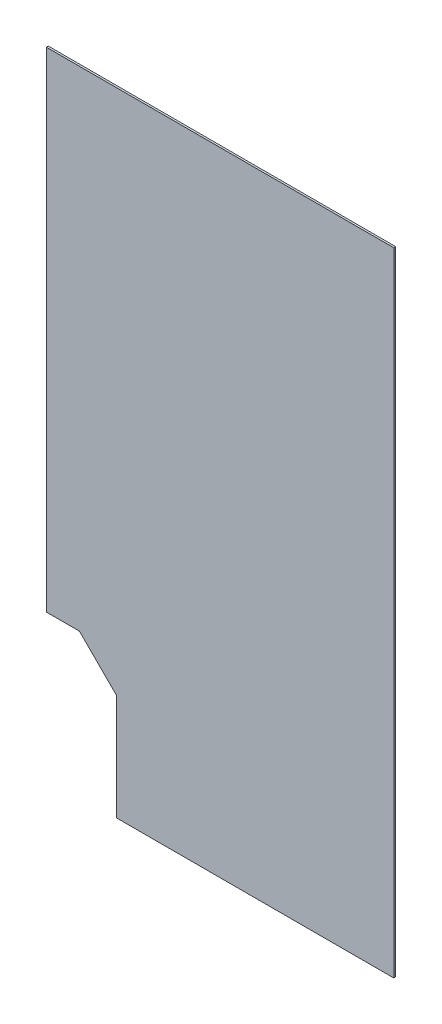
ISO-10303-21;
HEADER;
FILE_DESCRIPTION(('STEP AP214'),'2;1');
FILE_NAME('part.step','',(''),(''),'','','');
FILE_SCHEMA(('AUTOMOTIVE_DESIGN { 1 0 10303 214 1 1 1 1 }'));
ENDSEC;
DATA;
#1=APPLICATION_CONTEXT('core data for automotive mechanical design processes');
#2=APPLICATION_PROTOCOL_DEFINITION('international standard','automotive_design',2000,#1);
#3=PRODUCT_CONTEXT('',#1,'mechanical');
#4=PRODUCT('Part','Part','',(#3));
#5=PRODUCT_RELATED_PRODUCT_CATEGORY('part','',(#4));
#6=PRODUCT_DEFINITION_FORMATION('','',#4);
#7=PRODUCT_DEFINITION_CONTEXT('part definition',#1,'design');
#8=PRODUCT_DEFINITION('design','',#6,#7);
#9=PRODUCT_DEFINITION_SHAPE('','',#8);
#10=(LENGTH_UNIT() NAMED_UNIT(*) SI_UNIT(.MILLI.,.METRE.));
#11=(NAMED_UNIT(*) PLANE_ANGLE_UNIT() SI_UNIT($,.RADIAN.));
#12=(NAMED_UNIT(*) SI_UNIT($,.STERADIAN.) SOLID_ANGLE_UNIT());
#13=UNCERTAINTY_MEASURE_WITH_UNIT(LENGTH_MEASURE(1.E-05),#10,'distance_accuracy_value','');
#14=(GEOMETRIC_REPRESENTATION_CONTEXT(3) GLOBAL_UNCERTAINTY_ASSIGNED_CONTEXT((#13)) GLOBAL_UNIT_ASSIGNED_CONTEXT((#10,
#11,#12)) REPRESENTATION_CONTEXT('',''));
#15=CARTESIAN_POINT('',(0.,0.,0.));
#16=DIRECTION('',(0.,0.,1.));
#17=DIRECTION('',(1.,0.,0.));
#18=AXIS2_PLACEMENT_3D('',#15,#16,#17);
#19=CARTESIAN_POINT('',(941.188811188811,1472.76923076923,8.));
#20=DIRECTION('',(-1.,0.,0.));
#21=DIRECTION('',(0.,-1.,0.));
#22=AXIS2_PLACEMENT_3D('',#19,#20,#21);
#23=PLANE('',#22);
#24=DIRECTION('',(0.,1.,0.));
#25=VECTOR('',#24,1.);
#26=CARTESIAN_POINT('',(941.188811188811,1472.76923076923,0.));
#27=LINE('',#26,#25);
#28=CARTESIAN_POINT('',(941.188811188812,-1102.23076923077,0.));
#29=VERTEX_POINT('',#28);
#30=CARTESIAN_POINT('',(941.188811188811,1472.76923076923,0.));
#31=VERTEX_POINT('',#30);
#32=EDGE_CURVE('E131',#29,#31,#27,.T.);
#33=ORIENTED_EDGE('',*,*,#32,.T.);
#34=DIRECTION('',(0.,0.,-1.));
#35=VECTOR('',#34,1.);
#36=CARTESIAN_POINT('',(941.188811188811,1472.76923076923,8.));
#37=LINE('',#36,#35);
#38=CARTESIAN_POINT('',(941.188811188811,1472.76923076923,8.));
#39=VERTEX_POINT('',#38);
#40=EDGE_CURVE('E11',#39,#31,#37,.T.);
#41=ORIENTED_EDGE('',*,*,#40,.F.);
#42=DIRECTION('',(0.,1.,0.));
#43=VECTOR('',#42,1.);
#44=CARTESIAN_POINT('',(941.188811188811,1472.76923076923,8.));
#45=LINE('',#44,#43);
#46=CARTESIAN_POINT('',(941.188811188812,-1102.23076923077,8.));
#47=VERTEX_POINT('',#46);
#48=EDGE_CURVE('E143',#47,#39,#45,.T.);
#49=ORIENTED_EDGE('',*,*,#48,.F.);
#50=DIRECTION('',(0.,0.,-1.));
#51=VECTOR('',#50,1.);
#52=CARTESIAN_POINT('',(941.188811188812,-1102.23076923077,8.));
#53=LINE('',#52,#51);
#54=EDGE_CURVE('E127',#47,#29,#53,.T.);
#55=ORIENTED_EDGE('',*,*,#54,.T.);
#56=EDGE_LOOP('',(#33,#41,#49,#55));
#57=FACE_BOUND('',#56,.T.);
#58=ADVANCED_FACE('F41',(#57),#23,.F.);
#59=CARTESIAN_POINT('',(-473.811188811189,1472.76923076923,8.));
#60=DIRECTION('',(0.,-1.,0.));
#61=DIRECTION('',(0.,0.,-1.));
#62=AXIS2_PLACEMENT_3D('',#59,#60,#61);
#63=PLANE('',#62);
#64=DIRECTION('',(-1.,0.,0.));
#65=VECTOR('',#64,1.);
#66=CARTESIAN_POINT('',(-473.811188811189,1472.76923076923,0.));
#67=LINE('',#66,#65);
#68=CARTESIAN_POINT('',(-473.811188811189,1472.76923076923,0.));
#69=VERTEX_POINT('',#68);
#70=EDGE_CURVE('E134',#31,#69,#67,.T.);
#71=ORIENTED_EDGE('',*,*,#70,.T.);
#72=DIRECTION('',(0.,0.,-1.));
#73=VECTOR('',#72,1.);
#74=CARTESIAN_POINT('',(-473.811188811189,1472.76923076923,8.));
#75=LINE('',#74,#73);
#76=CARTESIAN_POINT('',(-473.811188811189,1472.76923076923,8.));
#77=VERTEX_POINT('',#76);
#78=EDGE_CURVE('E49',#77,#69,#75,.T.);
#79=ORIENTED_EDGE('',*,*,#78,.F.);
#80=DIRECTION('',(-1.,0.,0.));
#81=VECTOR('',#80,1.);
#82=CARTESIAN_POINT('',(-473.811188811189,1472.76923076923,8.));
#83=LINE('',#82,#81);
#84=EDGE_CURVE('E97',#39,#77,#83,.T.);
#85=ORIENTED_EDGE('',*,*,#84,.F.);
#86=ORIENTED_EDGE('',*,*,#40,.T.);
#87=EDGE_LOOP('',(#71,#79,#85,#86));
#88=FACE_BOUND('',#87,.T.);
#89=ADVANCED_FACE('F168',(#88),#63,.F.);
#90=CARTESIAN_POINT('',(-473.811188811189,-519.230769230769,8.));
#91=DIRECTION('',(1.,0.,0.));
#92=DIRECTION('',(0.,0.,-1.));
#93=AXIS2_PLACEMENT_3D('',#90,#91,#92);
#94=PLANE('',#93);
#95=DIRECTION('',(0.,-1.,0.));
#96=VECTOR('',#95,1.);
#97=CARTESIAN_POINT('',(-473.811188811189,-519.230769230769,0.));
#98=LINE('',#97,#96);
#99=CARTESIAN_POINT('',(-473.811188811189,-519.230769230769,0.));
#100=VERTEX_POINT('',#99);
#101=EDGE_CURVE('E136',#69,#100,#98,.T.);
#102=ORIENTED_EDGE('',*,*,#101,.T.);
#103=DIRECTION('',(0.,0.,-1.));
#104=VECTOR('',#103,1.);
#105=CARTESIAN_POINT('',(-473.811188811189,-519.230769230769,8.));
#106=LINE('',#105,#104);
#107=CARTESIAN_POINT('',(-473.811188811189,-519.230769230769,8.));
#108=VERTEX_POINT('',#107);
#109=EDGE_CURVE('E147',#108,#100,#106,.T.);
#110=ORIENTED_EDGE('',*,*,#109,.F.);
#111=DIRECTION('',(0.,-1.,0.));
#112=VECTOR('',#111,1.);
#113=CARTESIAN_POINT('',(-473.811188811189,-519.230769230769,8.));
#114=LINE('',#113,#112);
#115=EDGE_CURVE('E155',#77,#108,#114,.T.);
#116=ORIENTED_EDGE('',*,*,#115,.F.);
#117=ORIENTED_EDGE('',*,*,#78,.T.);
#118=EDGE_LOOP('',(#102,#110,#116,#117));
#119=FACE_BOUND('',#118,.T.);
#120=ADVANCED_FACE('F153',(#119),#94,.F.);
#121=CARTESIAN_POINT('',(-338.811188811189,-519.230769230769,8.));
#122=DIRECTION('',(0.,1.,0.));
#123=DIRECTION('',(0.,0.,1.));
#124=AXIS2_PLACEMENT_3D('',#121,#122,#123);
#125=PLANE('',#124);
#126=DIRECTION('',(1.,0.,0.));
#127=VECTOR('',#126,1.);
#128=CARTESIAN_POINT('',(-338.811188811189,-519.230769230769,0.));
#129=LINE('',#128,#127);
#130=CARTESIAN_POINT('',(-338.811188811189,-519.230769230769,0.));
#131=VERTEX_POINT('',#130);
#132=EDGE_CURVE('E138',#100,#131,#129,.T.);
#133=ORIENTED_EDGE('',*,*,#132,.T.);
#134=DIRECTION('',(0.,0.,-1.));
#135=VECTOR('',#134,1.);
#136=CARTESIAN_POINT('',(-338.811188811189,-519.230769230769,8.));
#137=LINE('',#136,#135);
#138=CARTESIAN_POINT('',(-338.811188811189,-519.230769230769,8.));
#139=VERTEX_POINT('',#138);
#140=EDGE_CURVE('E122',#139,#131,#137,.T.);
#141=ORIENTED_EDGE('',*,*,#140,.F.);
#142=DIRECTION('',(1.,0.,0.));
#143=VECTOR('',#142,1.);
#144=CARTESIAN_POINT('',(-338.811188811189,-519.230769230769,8.));
#145=LINE('',#144,#143);
#146=EDGE_CURVE('E113',#108,#139,#145,.T.);
#147=ORIENTED_EDGE('',*,*,#146,.F.);
#148=ORIENTED_EDGE('',*,*,#109,.T.);
#149=EDGE_LOOP('',(#133,#141,#147,#148));
#150=FACE_BOUND('',#149,.T.);
#151=ADVANCED_FACE('F161',(#150),#125,.F.);
#152=CARTESIAN_POINT('',(-188.811188811188,-669.230769230769,8.));
#153=DIRECTION('',(0.707106781186547,0.707106781186548,0.));
#154=DIRECTION('',(-0.707106781186548,0.707106781186547,0.));
#155=AXIS2_PLACEMENT_3D('',#152,#153,#154);
#156=PLANE('',#155);
#157=DIRECTION('',(0.707106781186548,-0.707106781186547,0.));
#158=VECTOR('',#157,1.);
#159=CARTESIAN_POINT('',(-188.811188811188,-669.230769230769,0.));
#160=LINE('',#159,#158);
#161=CARTESIAN_POINT('',(-188.811188811188,-669.230769230769,0.));
#162=VERTEX_POINT('',#161);
#163=EDGE_CURVE('E121',#131,#162,#160,.T.);
#164=ORIENTED_EDGE('',*,*,#163,.T.);
#165=DIRECTION('',(0.,0.,-1.));
#166=VECTOR('',#165,1.);
#167=CARTESIAN_POINT('',(-188.811188811188,-669.230769230769,8.));
#168=LINE('',#167,#166);
#169=CARTESIAN_POINT('',(-188.811188811188,-669.230769230769,8.));
#170=VERTEX_POINT('',#169);
#171=EDGE_CURVE('E118',#170,#162,#168,.T.);
#172=ORIENTED_EDGE('',*,*,#171,.F.);
#173=DIRECTION('',(0.707106781186548,-0.707106781186547,0.));
#174=VECTOR('',#173,1.);
#175=CARTESIAN_POINT('',(-188.811188811188,-669.230769230769,8.));
#176=LINE('',#175,#174);
#177=EDGE_CURVE('E107',#139,#170,#176,.T.);
#178=ORIENTED_EDGE('',*,*,#177,.F.);
#179=ORIENTED_EDGE('',*,*,#140,.T.);
#180=EDGE_LOOP('',(#164,#172,#178,#179));
#181=FACE_BOUND('',#180,.T.);
#182=ADVANCED_FACE('F119',(#181),#156,.F.);
#183=CARTESIAN_POINT('',(-188.811188811188,-1102.23076923077,8.));
#184=DIRECTION('',(1.,0.,0.));
#185=DIRECTION('',(0.,1.,0.));
#186=AXIS2_PLACEMENT_3D('',#183,#184,#185);
#187=PLANE('',#186);
#188=DIRECTION('',(0.,-1.,0.));
#189=VECTOR('',#188,1.);
#190=CARTESIAN_POINT('',(-188.811188811188,-1102.23076923077,0.));
#191=LINE('',#190,#189);
#192=CARTESIAN_POINT('',(-188.811188811188,-1102.23076923077,0.));
#193=VERTEX_POINT('',#192);
#194=EDGE_CURVE('E83',#162,#193,#191,.T.);
#195=ORIENTED_EDGE('',*,*,#194,.T.);
#196=DIRECTION('',(0.,0.,-1.));
#197=VECTOR('',#196,1.);
#198=CARTESIAN_POINT('',(-188.811188811188,-1102.23076923077,8.));
#199=LINE('',#198,#197);
#200=CARTESIAN_POINT('',(-188.811188811188,-1102.23076923077,8.));
#201=VERTEX_POINT('',#200);
#202=EDGE_CURVE('E123',#201,#193,#199,.T.);
#203=ORIENTED_EDGE('',*,*,#202,.F.);
#204=DIRECTION('',(0.,-1.,0.));
#205=VECTOR('',#204,1.);
#206=CARTESIAN_POINT('',(-188.811188811188,-1102.23076923077,8.));
#207=LINE('',#206,#205);
#208=EDGE_CURVE('E111',#170,#201,#207,.T.);
#209=ORIENTED_EDGE('',*,*,#208,.F.);
#210=ORIENTED_EDGE('',*,*,#171,.T.);
#211=EDGE_LOOP('',(#195,#203,#209,#210));
#212=FACE_BOUND('',#211,.T.);
#213=ADVANCED_FACE('F125',(#212),#187,.F.);
#214=CARTESIAN_POINT('',(941.188811188812,-1102.23076923077,8.));
#215=DIRECTION('',(0.,1.,0.));
#216=DIRECTION('',(-1.,0.,0.));
#217=AXIS2_PLACEMENT_3D('',#214,#215,#216);
#218=PLANE('',#217);
#219=DIRECTION('',(1.,0.,0.));
#220=VECTOR('',#219,1.);
#221=CARTESIAN_POINT('',(941.188811188812,-1102.23076923077,0.));
#222=LINE('',#221,#220);
#223=EDGE_CURVE('E89',#193,#29,#222,.T.);
#224=ORIENTED_EDGE('',*,*,#223,.T.);
#225=ORIENTED_EDGE('',*,*,#54,.F.);
#226=DIRECTION('',(1.,0.,0.));
#227=VECTOR('',#226,1.);
#228=CARTESIAN_POINT('',(941.188811188812,-1102.23076923077,8.));
#229=LINE('',#228,#227);
#230=EDGE_CURVE('E57',#201,#47,#229,.T.);
#231=ORIENTED_EDGE('',*,*,#230,.F.);
#232=ORIENTED_EDGE('',*,*,#202,.T.);
#233=EDGE_LOOP('',(#224,#225,#231,#232));
#234=FACE_BOUND('',#233,.T.);
#235=ADVANCED_FACE('F182',(#234),#218,.F.);
#236=CARTESIAN_POINT('',(0.,0.,8.));
#237=DIRECTION('',(0.,0.,-1.));
#238=DIRECTION('',(-1.,0.,0.));
#239=AXIS2_PLACEMENT_3D('',#236,#237,#238);
#240=PLANE('',#239);
#241=ORIENTED_EDGE('',*,*,#48,.T.);
#242=ORIENTED_EDGE('',*,*,#84,.T.);
#243=ORIENTED_EDGE('',*,*,#115,.T.);
#244=ORIENTED_EDGE('',*,*,#146,.T.);
#245=ORIENTED_EDGE('',*,*,#177,.T.);
#246=ORIENTED_EDGE('',*,*,#208,.T.);
#247=ORIENTED_EDGE('',*,*,#230,.T.);
#248=EDGE_LOOP('',(#241,#242,#243,#244,#245,#246,#247));
#249=FACE_BOUND('',#248,.T.);
#250=ADVANCED_FACE('F109',(#249),#240,.F.);
#251=CARTESIAN_POINT('',(0.,0.,0.));
#252=DIRECTION('',(0.,0.,-1.));
#253=DIRECTION('',(-1.,0.,0.));
#254=AXIS2_PLACEMENT_3D('',#251,#252,#253);
#255=PLANE('',#254);
#256=ORIENTED_EDGE('',*,*,#32,.F.);
#257=ORIENTED_EDGE('',*,*,#223,.F.);
#258=ORIENTED_EDGE('',*,*,#194,.F.);
#259=ORIENTED_EDGE('',*,*,#163,.F.);
#260=ORIENTED_EDGE('',*,*,#132,.F.);
#261=ORIENTED_EDGE('',*,*,#101,.F.);
#262=ORIENTED_EDGE('',*,*,#70,.F.);
#263=EDGE_LOOP('',(#256,#257,#258,#259,#260,#261,#262));
#264=FACE_BOUND('',#263,.T.);
#265=ADVANCED_FACE('F159',(#264),#255,.T.);
#266=CLOSED_SHELL('',(#58,#89,#120,#151,#182,#213,#235,#250,#265));
#267=MANIFOLD_SOLID_BREP('B2',#266);
#268=ADVANCED_BREP_SHAPE_REPRESENTATION('',(#18,#267),#14);
#269=SHAPE_DEFINITION_REPRESENTATION(#9,#268);
ENDSEC;
END-ISO-10303-21;
